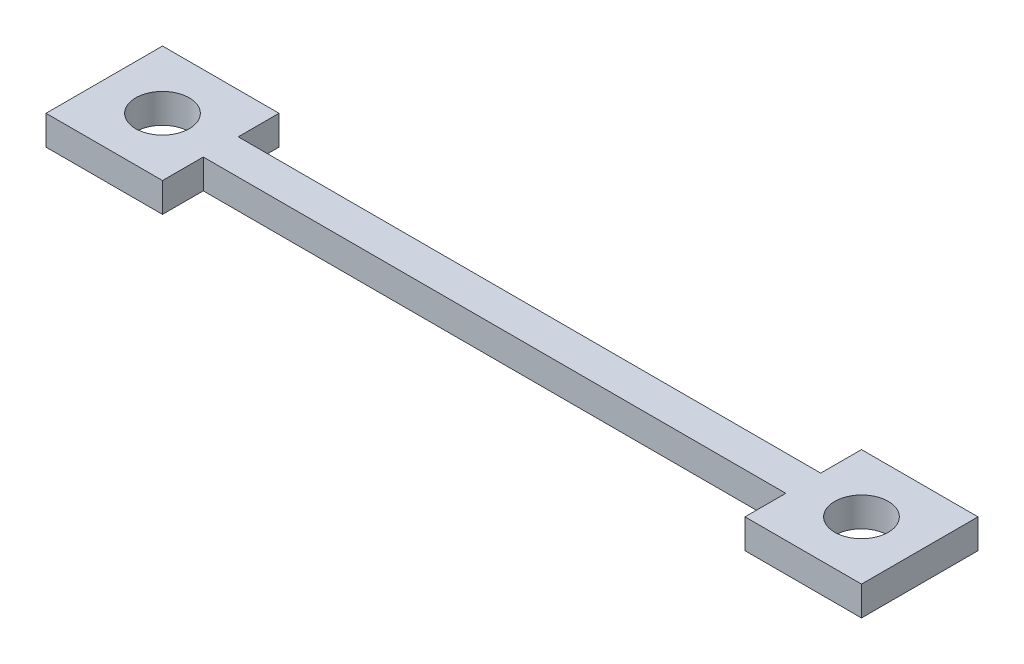
ISO-10303-21;
HEADER;
FILE_DESCRIPTION(('STEP AP214'),'2;1');
FILE_NAME('part.step','',(''),(''),'','','');
FILE_SCHEMA(('AUTOMOTIVE_DESIGN { 1 0 10303 214 1 1 1 1 }'));
ENDSEC;
DATA;
#1=APPLICATION_CONTEXT('core data for automotive mechanical design processes');
#2=APPLICATION_PROTOCOL_DEFINITION('international standard','automotive_design',2000,#1);
#3=PRODUCT_CONTEXT('',#1,'mechanical');
#4=PRODUCT('Part','Part','',(#3));
#5=PRODUCT_RELATED_PRODUCT_CATEGORY('part','',(#4));
#6=PRODUCT_DEFINITION_FORMATION('','',#4);
#7=PRODUCT_DEFINITION_CONTEXT('part definition',#1,'design');
#8=PRODUCT_DEFINITION('design','',#6,#7);
#9=PRODUCT_DEFINITION_SHAPE('','',#8);
#10=(LENGTH_UNIT() NAMED_UNIT(*) SI_UNIT(.MILLI.,.METRE.));
#11=(NAMED_UNIT(*) PLANE_ANGLE_UNIT() SI_UNIT($,.RADIAN.));
#12=(NAMED_UNIT(*) SI_UNIT($,.STERADIAN.) SOLID_ANGLE_UNIT());
#13=UNCERTAINTY_MEASURE_WITH_UNIT(LENGTH_MEASURE(1.E-05),#10,'distance_accuracy_value','');
#14=(GEOMETRIC_REPRESENTATION_CONTEXT(3) GLOBAL_UNCERTAINTY_ASSIGNED_CONTEXT((#13)) GLOBAL_UNIT_ASSIGNED_CONTEXT((#10,
#11,#12)) REPRESENTATION_CONTEXT('',''));
#15=CARTESIAN_POINT('',(0.,0.,0.));
#16=DIRECTION('',(0.,0.,1.));
#17=DIRECTION('',(1.,0.,0.));
#18=AXIS2_PLACEMENT_3D('',#15,#16,#17);
#19=CARTESIAN_POINT('',(-9.67404648456241,0.8001,6.15575946530759));
#20=DIRECTION('',(0.,0.,1.));
#21=DIRECTION('',(1.,0.,0.));
#22=AXIS2_PLACEMENT_3D('',#19,#20,#21);
#23=PLANE('',#22);
#24=DIRECTION('',(-1.,0.,0.));
#25=VECTOR('',#24,1.);
#26=CARTESIAN_POINT('',(-9.67404648456241,-0.8001,6.15575946530759));
#27=LINE('',#26,#25);
#28=CARTESIAN_POINT('',(-3.32404648456241,-0.8001,6.15575946530759));
#29=VERTEX_POINT('',#28);
#30=CARTESIAN_POINT('',(-9.67404648456241,-0.8001,6.15575946530759));
#31=VERTEX_POINT('',#30);
#32=EDGE_CURVE('E156',#29,#31,#27,.T.);
#33=ORIENTED_EDGE('',*,*,#32,.T.);
#34=DIRECTION('',(0.,-1.,0.));
#35=VECTOR('',#34,1.);
#36=CARTESIAN_POINT('',(-9.67404648456241,0.8001,6.15575946530759));
#37=LINE('',#36,#35);
#38=CARTESIAN_POINT('',(-9.67404648456241,0.8001,6.15575946530759));
#39=VERTEX_POINT('',#38);
#40=EDGE_CURVE('E11',#39,#31,#37,.T.);
#41=ORIENTED_EDGE('',*,*,#40,.F.);
#42=DIRECTION('',(-1.,0.,0.));
#43=VECTOR('',#42,1.);
#44=CARTESIAN_POINT('',(-9.67404648456241,0.8001,6.15575946530759));
#45=LINE('',#44,#43);
#46=CARTESIAN_POINT('',(-3.32404648456241,0.8001,6.15575946530759));
#47=VERTEX_POINT('',#46);
#48=EDGE_CURVE('E179',#47,#39,#45,.T.);
#49=ORIENTED_EDGE('',*,*,#48,.F.);
#50=DIRECTION('',(0.,-1.,0.));
#51=VECTOR('',#50,1.);
#52=CARTESIAN_POINT('',(-3.32404648456241,0.8001,6.15575946530759));
#53=LINE('',#52,#51);
#54=EDGE_CURVE('E152',#47,#29,#53,.T.);
#55=ORIENTED_EDGE('',*,*,#54,.T.);
#56=EDGE_LOOP('',(#33,#41,#49,#55));
#57=FACE_BOUND('',#56,.T.);
#58=ADVANCED_FACE('F36',(#57),#23,.F.);
#59=CARTESIAN_POINT('',(-9.67404648456241,0.8001,8.37825946530759));
#60=DIRECTION('',(1.,0.,0.));
#61=DIRECTION('',(0.,0.,-1.));
#62=AXIS2_PLACEMENT_3D('',#59,#60,#61);
#63=PLANE('',#62);
#64=DIRECTION('',(0.,0.,1.));
#65=VECTOR('',#64,1.);
#66=CARTESIAN_POINT('',(-9.67404648456241,-0.8001,8.37825946530759));
#67=LINE('',#66,#65);
#68=CARTESIAN_POINT('',(-9.67404648456241,-0.8001,8.37825946530759));
#69=VERTEX_POINT('',#68);
#70=EDGE_CURVE('E159',#31,#69,#67,.T.);
#71=ORIENTED_EDGE('',*,*,#70,.T.);
#72=DIRECTION('',(0.,-1.,0.));
#73=VECTOR('',#72,1.);
#74=CARTESIAN_POINT('',(-9.67404648456241,0.8001,8.37825946530759));
#75=LINE('',#74,#73);
#76=CARTESIAN_POINT('',(-9.67404648456241,0.8001,8.37825946530759));
#77=VERTEX_POINT('',#76);
#78=EDGE_CURVE('E44',#77,#69,#75,.T.);
#79=ORIENTED_EDGE('',*,*,#78,.F.);
#80=DIRECTION('',(0.,0.,1.));
#81=VECTOR('',#80,1.);
#82=CARTESIAN_POINT('',(-9.67404648456241,0.8001,8.37825946530759));
#83=LINE('',#82,#81);
#84=EDGE_CURVE('E107',#39,#77,#83,.T.);
#85=ORIENTED_EDGE('',*,*,#84,.F.);
#86=ORIENTED_EDGE('',*,*,#40,.T.);
#87=EDGE_LOOP('',(#71,#79,#85,#86));
#88=FACE_BOUND('',#87,.T.);
#89=ADVANCED_FACE('F258',(#88),#63,.F.);
#90=CARTESIAN_POINT('',(-41.4240464845624,0.8001,8.37825946530759));
#91=DIRECTION('',(0.,0.,1.));
#92=DIRECTION('',(1.,0.,0.));
#93=AXIS2_PLACEMENT_3D('',#90,#91,#92);
#94=PLANE('',#93);
#95=DIRECTION('',(-1.,0.,0.));
#96=VECTOR('',#95,1.);
#97=CARTESIAN_POINT('',(-41.4240464845624,-0.8001,8.37825946530759));
#98=LINE('',#97,#96);
#99=CARTESIAN_POINT('',(-41.4240464845624,-0.8001,8.37825946530759));
#100=VERTEX_POINT('',#99);
#101=EDGE_CURVE('E162',#69,#100,#98,.T.);
#102=ORIENTED_EDGE('',*,*,#101,.T.);
#103=DIRECTION('',(0.,-1.,0.));
#104=VECTOR('',#103,1.);
#105=CARTESIAN_POINT('',(-41.4240464845624,0.8001,8.37825946530759));
#106=LINE('',#105,#104);
#107=CARTESIAN_POINT('',(-41.4240464845624,0.8001,8.37825946530759));
#108=VERTEX_POINT('',#107);
#109=EDGE_CURVE('E198',#108,#100,#106,.T.);
#110=ORIENTED_EDGE('',*,*,#109,.F.);
#111=DIRECTION('',(-1.,0.,0.));
#112=VECTOR('',#111,1.);
#113=CARTESIAN_POINT('',(-41.4240464845624,0.8001,8.37825946530759));
#114=LINE('',#113,#112);
#115=EDGE_CURVE('E206',#77,#108,#114,.T.);
#116=ORIENTED_EDGE('',*,*,#115,.F.);
#117=ORIENTED_EDGE('',*,*,#78,.T.);
#118=EDGE_LOOP('',(#102,#110,#116,#117));
#119=FACE_BOUND('',#118,.T.);
#120=ADVANCED_FACE('F204',(#119),#94,.F.);
#121=CARTESIAN_POINT('',(-41.4240464845624,0.8001,8.37825946530759));
#122=DIRECTION('',(-1.,0.,0.));
#123=DIRECTION('',(0.,0.,1.));
#124=AXIS2_PLACEMENT_3D('',#121,#122,#123);
#125=PLANE('',#124);
#126=DIRECTION('',(0.,0.,-1.));
#127=VECTOR('',#126,1.);
#128=CARTESIAN_POINT('',(-41.4240464845624,-0.8001,8.37825946530759));
#129=LINE('',#128,#127);
#130=CARTESIAN_POINT('',(-41.4240464845624,-0.8001,6.15575946530758));
#131=VERTEX_POINT('',#130);
#132=EDGE_CURVE('E164',#100,#131,#129,.T.);
#133=ORIENTED_EDGE('',*,*,#132,.T.);
#134=DIRECTION('',(0.,-1.,0.));
#135=VECTOR('',#134,1.);
#136=CARTESIAN_POINT('',(-41.4240464845624,0.8001,6.15575946530758));
#137=LINE('',#136,#135);
#138=CARTESIAN_POINT('',(-41.4240464845624,0.8001,6.15575946530758));
#139=VERTEX_POINT('',#138);
#140=EDGE_CURVE('E195',#139,#131,#137,.T.);
#141=ORIENTED_EDGE('',*,*,#140,.F.);
#142=DIRECTION('',(0.,0.,-1.));
#143=VECTOR('',#142,1.);
#144=CARTESIAN_POINT('',(-41.4240464845624,0.8001,8.37825946530759));
#145=LINE('',#144,#143);
#146=EDGE_CURVE('E224',#108,#139,#145,.T.);
#147=ORIENTED_EDGE('',*,*,#146,.F.);
#148=ORIENTED_EDGE('',*,*,#109,.T.);
#149=EDGE_LOOP('',(#133,#141,#147,#148));
#150=FACE_BOUND('',#149,.T.);
#151=ADVANCED_FACE('F215',(#150),#125,.F.);
#152=CARTESIAN_POINT('',(-47.7740464845624,0.8001,6.15575946530758));
#153=DIRECTION('',(0.,0.,1.));
#154=DIRECTION('',(1.,0.,0.));
#155=AXIS2_PLACEMENT_3D('',#152,#153,#154);
#156=PLANE('',#155);
#157=DIRECTION('',(-1.,0.,0.));
#158=VECTOR('',#157,1.);
#159=CARTESIAN_POINT('',(-47.7740464845624,-0.8001,6.15575946530758));
#160=LINE('',#159,#158);
#161=CARTESIAN_POINT('',(-47.7740464845624,-0.8001,6.15575946530758));
#162=VERTEX_POINT('',#161);
#163=EDGE_CURVE('E166',#131,#162,#160,.T.);
#164=ORIENTED_EDGE('',*,*,#163,.T.);
#165=DIRECTION('',(0.,-1.,0.));
#166=VECTOR('',#165,1.);
#167=CARTESIAN_POINT('',(-47.7740464845624,0.8001,6.15575946530758));
#168=LINE('',#167,#166);
#169=CARTESIAN_POINT('',(-47.7740464845624,0.8001,6.15575946530758));
#170=VERTEX_POINT('',#169);
#171=EDGE_CURVE('E192',#170,#162,#168,.T.);
#172=ORIENTED_EDGE('',*,*,#171,.F.);
#173=DIRECTION('',(-1.,0.,0.));
#174=VECTOR('',#173,1.);
#175=CARTESIAN_POINT('',(-47.7740464845624,0.8001,6.15575946530758));
#176=LINE('',#175,#174);
#177=EDGE_CURVE('E221',#139,#170,#176,.T.);
#178=ORIENTED_EDGE('',*,*,#177,.F.);
#179=ORIENTED_EDGE('',*,*,#140,.T.);
#180=EDGE_LOOP('',(#164,#172,#178,#179));
#181=FACE_BOUND('',#180,.T.);
#182=ADVANCED_FACE('F219',(#181),#156,.F.);
#183=CARTESIAN_POINT('',(-47.7740464845624,0.8001,12.5057594653076));
#184=DIRECTION('',(1.,0.,0.));
#185=DIRECTION('',(0.,0.,-1.));
#186=AXIS2_PLACEMENT_3D('',#183,#184,#185);
#187=PLANE('',#186);
#188=DIRECTION('',(0.,0.,1.));
#189=VECTOR('',#188,1.);
#190=CARTESIAN_POINT('',(-47.7740464845624,-0.8001,12.5057594653076));
#191=LINE('',#190,#189);
#192=CARTESIAN_POINT('',(-47.7740464845624,-0.8001,12.5057594653076));
#193=VERTEX_POINT('',#192);
#194=EDGE_CURVE('E168',#162,#193,#191,.T.);
#195=ORIENTED_EDGE('',*,*,#194,.T.);
#196=DIRECTION('',(0.,-1.,0.));
#197=VECTOR('',#196,1.);
#198=CARTESIAN_POINT('',(-47.7740464845624,0.8001,12.5057594653076));
#199=LINE('',#198,#197);
#200=CARTESIAN_POINT('',(-47.7740464845624,0.8001,12.5057594653076));
#201=VERTEX_POINT('',#200);
#202=EDGE_CURVE('E189',#201,#193,#199,.T.);
#203=ORIENTED_EDGE('',*,*,#202,.F.);
#204=DIRECTION('',(0.,0.,1.));
#205=VECTOR('',#204,1.);
#206=CARTESIAN_POINT('',(-47.7740464845624,0.8001,12.5057594653076));
#207=LINE('',#206,#205);
#208=EDGE_CURVE('E223',#170,#201,#207,.T.);
#209=ORIENTED_EDGE('',*,*,#208,.F.);
#210=ORIENTED_EDGE('',*,*,#171,.T.);
#211=EDGE_LOOP('',(#195,#203,#209,#210));
#212=FACE_BOUND('',#211,.T.);
#213=ADVANCED_FACE('F271',(#212),#187,.F.);
#214=CARTESIAN_POINT('',(-47.7740464845624,0.8001,12.5057594653076));
#215=DIRECTION('',(0.,0.,-1.));
#216=DIRECTION('',(-1.,0.,0.));
#217=AXIS2_PLACEMENT_3D('',#214,#215,#216);
#218=PLANE('',#217);
#219=DIRECTION('',(1.,0.,0.));
#220=VECTOR('',#219,1.);
#221=CARTESIAN_POINT('',(-47.7740464845624,-0.8001,12.5057594653076));
#222=LINE('',#221,#220);
#223=CARTESIAN_POINT('',(-41.4240464845624,-0.8001,12.5057594653076));
#224=VERTEX_POINT('',#223);
#225=EDGE_CURVE('E170',#193,#224,#222,.T.);
#226=ORIENTED_EDGE('',*,*,#225,.T.);
#227=DIRECTION('',(0.,-1.,0.));
#228=VECTOR('',#227,1.);
#229=CARTESIAN_POINT('',(-41.4240464845624,0.8001,12.5057594653076));
#230=LINE('',#229,#228);
#231=CARTESIAN_POINT('',(-41.4240464845624,0.8001,12.5057594653076));
#232=VERTEX_POINT('',#231);
#233=EDGE_CURVE('E186',#232,#224,#230,.T.);
#234=ORIENTED_EDGE('',*,*,#233,.F.);
#235=DIRECTION('',(1.,0.,0.));
#236=VECTOR('',#235,1.);
#237=CARTESIAN_POINT('',(-47.7740464845624,0.8001,12.5057594653076));
#238=LINE('',#237,#236);
#239=EDGE_CURVE('E226',#201,#232,#238,.T.);
#240=ORIENTED_EDGE('',*,*,#239,.F.);
#241=ORIENTED_EDGE('',*,*,#202,.T.);
#242=EDGE_LOOP('',(#226,#234,#240,#241));
#243=FACE_BOUND('',#242,.T.);
#244=ADVANCED_FACE('F274',(#243),#218,.F.);
#245=CARTESIAN_POINT('',(-41.4240464845624,0.8001,10.2832594653076));
#246=DIRECTION('',(-1.,0.,0.));
#247=DIRECTION('',(0.,0.,1.));
#248=AXIS2_PLACEMENT_3D('',#245,#246,#247);
#249=PLANE('',#248);
#250=DIRECTION('',(0.,0.,-1.));
#251=VECTOR('',#250,1.);
#252=CARTESIAN_POINT('',(-41.4240464845624,-0.8001,10.2832594653076));
#253=LINE('',#252,#251);
#254=CARTESIAN_POINT('',(-41.4240464845624,-0.8001,10.2832594653076));
#255=VERTEX_POINT('',#254);
#256=EDGE_CURVE('E172',#224,#255,#253,.T.);
#257=ORIENTED_EDGE('',*,*,#256,.T.);
#258=DIRECTION('',(0.,-1.,0.));
#259=VECTOR('',#258,1.);
#260=CARTESIAN_POINT('',(-41.4240464845624,0.8001,10.2832594653076));
#261=LINE('',#260,#259);
#262=CARTESIAN_POINT('',(-41.4240464845624,0.8001,10.2832594653076));
#263=VERTEX_POINT('',#262);
#264=EDGE_CURVE('E183',#263,#255,#261,.T.);
#265=ORIENTED_EDGE('',*,*,#264,.F.);
#266=DIRECTION('',(0.,0.,-1.));
#267=VECTOR('',#266,1.);
#268=CARTESIAN_POINT('',(-41.4240464845624,0.8001,10.2832594653076));
#269=LINE('',#268,#267);
#270=EDGE_CURVE('E232',#232,#263,#269,.T.);
#271=ORIENTED_EDGE('',*,*,#270,.F.);
#272=ORIENTED_EDGE('',*,*,#233,.T.);
#273=EDGE_LOOP('',(#257,#265,#271,#272));
#274=FACE_BOUND('',#273,.T.);
#275=ADVANCED_FACE('F238',(#274),#249,.F.);
#276=CARTESIAN_POINT('',(-41.4240464845624,0.8001,10.2832594653076));
#277=DIRECTION('',(0.,0.,-1.));
#278=DIRECTION('',(-1.,0.,0.));
#279=AXIS2_PLACEMENT_3D('',#276,#277,#278);
#280=PLANE('',#279);
#281=DIRECTION('',(1.,0.,0.));
#282=VECTOR('',#281,1.);
#283=CARTESIAN_POINT('',(-41.4240464845624,-0.8001,10.2832594653076));
#284=LINE('',#283,#282);
#285=CARTESIAN_POINT('',(-9.67404648456241,-0.8001,10.2832594653076));
#286=VERTEX_POINT('',#285);
#287=EDGE_CURVE('E174',#255,#286,#284,.T.);
#288=ORIENTED_EDGE('',*,*,#287,.T.);
#289=DIRECTION('',(0.,-1.,0.));
#290=VECTOR('',#289,1.);
#291=CARTESIAN_POINT('',(-9.67404648456241,0.8001,10.2832594653076));
#292=LINE('',#291,#290);
#293=CARTESIAN_POINT('',(-9.67404648456241,0.8001,10.2832594653076));
#294=VERTEX_POINT('',#293);
#295=EDGE_CURVE('E147',#294,#286,#292,.T.);
#296=ORIENTED_EDGE('',*,*,#295,.F.);
#297=DIRECTION('',(1.,0.,0.));
#298=VECTOR('',#297,1.);
#299=CARTESIAN_POINT('',(-41.4240464845624,0.8001,10.2832594653076));
#300=LINE('',#299,#298);
#301=EDGE_CURVE('E138',#263,#294,#300,.T.);
#302=ORIENTED_EDGE('',*,*,#301,.F.);
#303=ORIENTED_EDGE('',*,*,#264,.T.);
#304=EDGE_LOOP('',(#288,#296,#302,#303));
#305=FACE_BOUND('',#304,.T.);
#306=ADVANCED_FACE('F242',(#305),#280,.F.);
#307=CARTESIAN_POINT('',(-9.67404648456241,0.8001,10.2832594653076));
#308=DIRECTION('',(1.,0.,0.));
#309=DIRECTION('',(0.,0.,-1.));
#310=AXIS2_PLACEMENT_3D('',#307,#308,#309);
#311=PLANE('',#310);
#312=DIRECTION('',(0.,0.,1.));
#313=VECTOR('',#312,1.);
#314=CARTESIAN_POINT('',(-9.67404648456241,-0.8001,10.2832594653076));
#315=LINE('',#314,#313);
#316=CARTESIAN_POINT('',(-9.67404648456241,-0.8001,12.5057594653076));
#317=VERTEX_POINT('',#316);
#318=EDGE_CURVE('E146',#286,#317,#315,.T.);
#319=ORIENTED_EDGE('',*,*,#318,.T.);
#320=DIRECTION('',(0.,-1.,0.));
#321=VECTOR('',#320,1.);
#322=CARTESIAN_POINT('',(-9.67404648456241,0.8001,12.5057594653076));
#323=LINE('',#322,#321);
#324=CARTESIAN_POINT('',(-9.67404648456241,0.8001,12.5057594653076));
#325=VERTEX_POINT('',#324);
#326=EDGE_CURVE('E143',#325,#317,#323,.T.);
#327=ORIENTED_EDGE('',*,*,#326,.F.);
#328=DIRECTION('',(0.,0.,1.));
#329=VECTOR('',#328,1.);
#330=CARTESIAN_POINT('',(-9.67404648456241,0.8001,10.2832594653076));
#331=LINE('',#330,#329);
#332=EDGE_CURVE('E132',#294,#325,#331,.T.);
#333=ORIENTED_EDGE('',*,*,#332,.F.);
#334=ORIENTED_EDGE('',*,*,#295,.T.);
#335=EDGE_LOOP('',(#319,#327,#333,#334));
#336=FACE_BOUND('',#335,.T.);
#337=ADVANCED_FACE('F144',(#336),#311,.F.);
#338=CARTESIAN_POINT('',(-9.67404648456241,0.8001,12.5057594653076));
#339=DIRECTION('',(0.,0.,-1.));
#340=DIRECTION('',(-1.,0.,0.));
#341=AXIS2_PLACEMENT_3D('',#338,#339,#340);
#342=PLANE('',#341);
#343=DIRECTION('',(1.,0.,0.));
#344=VECTOR('',#343,1.);
#345=CARTESIAN_POINT('',(-9.67404648456241,-0.8001,12.5057594653076));
#346=LINE('',#345,#344);
#347=CARTESIAN_POINT('',(-3.32404648456241,-0.8001,12.5057594653076));
#348=VERTEX_POINT('',#347);
#349=EDGE_CURVE('E93',#317,#348,#346,.T.);
#350=ORIENTED_EDGE('',*,*,#349,.T.);
#351=DIRECTION('',(0.,-1.,0.));
#352=VECTOR('',#351,1.);
#353=CARTESIAN_POINT('',(-3.32404648456241,0.8001,12.5057594653076));
#354=LINE('',#353,#352);
#355=CARTESIAN_POINT('',(-3.32404648456241,0.8001,12.5057594653076));
#356=VERTEX_POINT('',#355);
#357=EDGE_CURVE('E148',#356,#348,#354,.T.);
#358=ORIENTED_EDGE('',*,*,#357,.F.);
#359=DIRECTION('',(1.,0.,0.));
#360=VECTOR('',#359,1.);
#361=CARTESIAN_POINT('',(-9.67404648456241,0.8001,12.5057594653076));
#362=LINE('',#361,#360);
#363=EDGE_CURVE('E136',#325,#356,#362,.T.);
#364=ORIENTED_EDGE('',*,*,#363,.F.);
#365=ORIENTED_EDGE('',*,*,#326,.T.);
#366=EDGE_LOOP('',(#350,#358,#364,#365));
#367=FACE_BOUND('',#366,.T.);
#368=ADVANCED_FACE('F150',(#367),#342,.F.);
#369=CARTESIAN_POINT('',(-3.32404648456241,0.8001,12.5057594653076));
#370=DIRECTION('',(-1.,0.,0.));
#371=DIRECTION('',(0.,0.,1.));
#372=AXIS2_PLACEMENT_3D('',#369,#370,#371);
#373=PLANE('',#372);
#374=DIRECTION('',(0.,0.,-1.));
#375=VECTOR('',#374,1.);
#376=CARTESIAN_POINT('',(-3.32404648456241,-0.8001,12.5057594653076));
#377=LINE('',#376,#375);
#378=EDGE_CURVE('E99',#348,#29,#377,.T.);
#379=ORIENTED_EDGE('',*,*,#378,.T.);
#380=ORIENTED_EDGE('',*,*,#54,.F.);
#381=DIRECTION('',(0.,0.,-1.));
#382=VECTOR('',#381,1.);
#383=CARTESIAN_POINT('',(-3.32404648456241,0.8001,12.5057594653076));
#384=LINE('',#383,#382);
#385=EDGE_CURVE('E52',#356,#47,#384,.T.);
#386=ORIENTED_EDGE('',*,*,#385,.F.);
#387=ORIENTED_EDGE('',*,*,#357,.T.);
#388=EDGE_LOOP('',(#379,#380,#386,#387));
#389=FACE_BOUND('',#388,.T.);
#390=ADVANCED_FACE('F246',(#389),#373,.F.);
#391=CARTESIAN_POINT('',(-3.32404648456241,0.8001,6.15575946530759));
#392=DIRECTION('',(0.,1.,0.));
#393=DIRECTION('',(0.,0.,1.));
#394=AXIS2_PLACEMENT_3D('',#391,#392,#393);
#395=PLANE('',#394);
#396=CARTESIAN_POINT('',(-6.49904648456241,0.8001,9.33075946530758));
#397=DIRECTION('',(0.,1.,0.));
#398=DIRECTION('',(0.,0.,1.));
#399=AXIS2_PLACEMENT_3D('',#396,#397,#398);
#400=CIRCLE('',#399,1.4605);
#401=CARTESIAN_POINT('',(-6.49904648456241,0.8001,10.7912594653076));
#402=VERTEX_POINT('',#401);
#403=EDGE_CURVE('E340',#402,#402,#400,.T.);
#404=ORIENTED_EDGE('',*,*,#403,.F.);
#405=EDGE_LOOP('',(#404));
#406=FACE_BOUND('',#405,.T.);
#407=CARTESIAN_POINT('',(-44.5990464845624,0.8001,9.33075946530758));
#408=DIRECTION('',(0.,1.,0.));
#409=DIRECTION('',(0.,0.,1.));
#410=AXIS2_PLACEMENT_3D('',#407,#408,#409);
#411=CIRCLE('',#410,1.4605);
#412=CARTESIAN_POINT('',(-44.5990464845624,0.8001,10.7912594653076));
#413=VERTEX_POINT('',#412);
#414=EDGE_CURVE('E342',#413,#413,#411,.T.);
#415=ORIENTED_EDGE('',*,*,#414,.F.);
#416=EDGE_LOOP('',(#415));
#417=FACE_BOUND('',#416,.T.);
#418=ORIENTED_EDGE('',*,*,#48,.T.);
#419=ORIENTED_EDGE('',*,*,#84,.T.);
#420=ORIENTED_EDGE('',*,*,#115,.T.);
#421=ORIENTED_EDGE('',*,*,#146,.T.);
#422=ORIENTED_EDGE('',*,*,#177,.T.);
#423=ORIENTED_EDGE('',*,*,#208,.T.);
#424=ORIENTED_EDGE('',*,*,#239,.T.);
#425=ORIENTED_EDGE('',*,*,#270,.T.);
#426=ORIENTED_EDGE('',*,*,#301,.T.);
#427=ORIENTED_EDGE('',*,*,#332,.T.);
#428=ORIENTED_EDGE('',*,*,#363,.T.);
#429=ORIENTED_EDGE('',*,*,#385,.T.);
#430=EDGE_LOOP('',(#418,#419,#420,#421,#422,#423,#424,#425,#426,#427,#428,#429));
#431=FACE_BOUND('',#430,.T.);
#432=ADVANCED_FACE('F134',(#406,#417,#431),#395,.T.);
#433=CARTESIAN_POINT('',(-3.32404648456241,-0.8001,6.15575946530759));
#434=DIRECTION('',(0.,1.,0.));
#435=DIRECTION('',(0.,0.,1.));
#436=AXIS2_PLACEMENT_3D('',#433,#434,#435);
#437=PLANE('',#436);
#438=CARTESIAN_POINT('',(-6.49904648456241,-0.8001,9.33075946530758));
#439=DIRECTION('',(0.,1.,0.));
#440=DIRECTION('',(0.,0.,1.));
#441=AXIS2_PLACEMENT_3D('',#438,#439,#440);
#442=CIRCLE('',#441,1.4605);
#443=CARTESIAN_POINT('',(-6.49904648456241,-0.8001,10.7912594653076));
#444=VERTEX_POINT('',#443);
#445=EDGE_CURVE('E337',#444,#444,#442,.T.);
#446=ORIENTED_EDGE('',*,*,#445,.T.);
#447=EDGE_LOOP('',(#446));
#448=FACE_BOUND('',#447,.T.);
#449=CARTESIAN_POINT('',(-44.5990464845624,-0.8001,9.33075946530758));
#450=DIRECTION('',(0.,1.,0.));
#451=DIRECTION('',(0.,0.,1.));
#452=AXIS2_PLACEMENT_3D('',#449,#450,#451);
#453=CIRCLE('',#452,1.4605);
#454=CARTESIAN_POINT('',(-44.5990464845624,-0.8001,10.7912594653076));
#455=VERTEX_POINT('',#454);
#456=EDGE_CURVE('E160',#455,#455,#453,.T.);
#457=ORIENTED_EDGE('',*,*,#456,.T.);
#458=EDGE_LOOP('',(#457));
#459=FACE_BOUND('',#458,.T.);
#460=ORIENTED_EDGE('',*,*,#32,.F.);
#461=ORIENTED_EDGE('',*,*,#378,.F.);
#462=ORIENTED_EDGE('',*,*,#349,.F.);
#463=ORIENTED_EDGE('',*,*,#318,.F.);
#464=ORIENTED_EDGE('',*,*,#287,.F.);
#465=ORIENTED_EDGE('',*,*,#256,.F.);
#466=ORIENTED_EDGE('',*,*,#225,.F.);
#467=ORIENTED_EDGE('',*,*,#194,.F.);
#468=ORIENTED_EDGE('',*,*,#163,.F.);
#469=ORIENTED_EDGE('',*,*,#132,.F.);
#470=ORIENTED_EDGE('',*,*,#101,.F.);
#471=ORIENTED_EDGE('',*,*,#70,.F.);
#472=EDGE_LOOP('',(#460,#461,#462,#463,#464,#465,#466,#467,#468,#469,#470,#471));
#473=FACE_BOUND('',#472,.T.);
#474=ADVANCED_FACE('F210',(#448,#459,#473),#437,.F.);
#475=CARTESIAN_POINT('',(-44.5990464845624,0.8001,9.33075946530758));
#476=DIRECTION('',(0.,1.,0.));
#477=DIRECTION('',(0.,0.,1.));
#478=AXIS2_PLACEMENT_3D('',#475,#476,#477);
#479=CYLINDRICAL_SURFACE('',#478,1.4605);
#480=ORIENTED_EDGE('',*,*,#456,.F.);
#481=EDGE_LOOP('',(#480));
#482=FACE_BOUND('',#481,.T.);
#483=ORIENTED_EDGE('',*,*,#414,.T.);
#484=EDGE_LOOP('',(#483));
#485=FACE_BOUND('',#484,.T.);
#486=ADVANCED_FACE('F302',(#482,#485),#479,.F.);
#487=CARTESIAN_POINT('',(-6.49904648456241,0.8001,9.33075946530758));
#488=DIRECTION('',(0.,1.,0.));
#489=DIRECTION('',(0.,0.,1.));
#490=AXIS2_PLACEMENT_3D('',#487,#488,#489);
#491=CYLINDRICAL_SURFACE('',#490,1.4605);
#492=ORIENTED_EDGE('',*,*,#445,.F.);
#493=EDGE_LOOP('',(#492));
#494=FACE_BOUND('',#493,.T.);
#495=ORIENTED_EDGE('',*,*,#403,.T.);
#496=EDGE_LOOP('',(#495));
#497=FACE_BOUND('',#496,.T.);
#498=ADVANCED_FACE('F307',(#494,#497),#491,.F.);
#499=CLOSED_SHELL('',(#58,#89,#120,#151,#182,#213,#244,#275,#306,#337,#368,#390,#432,#474,#486,#498));
#500=MANIFOLD_SOLID_BREP('B2',#499);
#501=ADVANCED_BREP_SHAPE_REPRESENTATION('',(#18,#500),#14);
#502=SHAPE_DEFINITION_REPRESENTATION(#9,#501);
ENDSEC;
END-ISO-10303-21;
